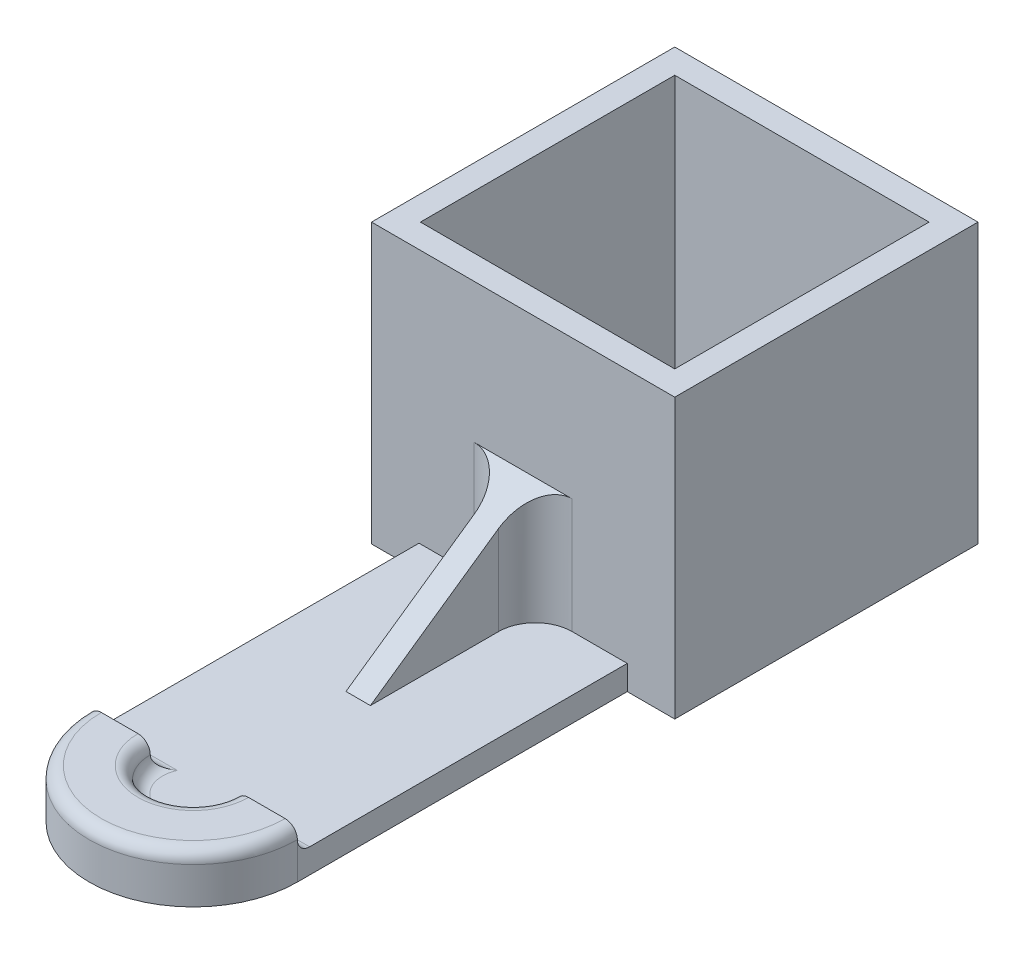
ISO-10303-21;
HEADER;
FILE_DESCRIPTION(('STEP AP214'),'2;1');
FILE_NAME('part.step','',(''),(''),'','','');
FILE_SCHEMA(('AUTOMOTIVE_DESIGN { 1 0 10303 214 1 1 1 1 }'));
ENDSEC;
DATA;
#1=APPLICATION_CONTEXT('core data for automotive mechanical design processes');
#2=APPLICATION_PROTOCOL_DEFINITION('international standard','automotive_design',2000,#1);
#3=PRODUCT_CONTEXT('',#1,'mechanical');
#4=PRODUCT('Part','Part','',(#3));
#5=PRODUCT_RELATED_PRODUCT_CATEGORY('part','',(#4));
#6=PRODUCT_DEFINITION_FORMATION('','',#4);
#7=PRODUCT_DEFINITION_CONTEXT('part definition',#1,'design');
#8=PRODUCT_DEFINITION('design','',#6,#7);
#9=PRODUCT_DEFINITION_SHAPE('','',#8);
#10=(LENGTH_UNIT() NAMED_UNIT(*) SI_UNIT(.MILLI.,.METRE.));
#11=(NAMED_UNIT(*) PLANE_ANGLE_UNIT() SI_UNIT($,.RADIAN.));
#12=(NAMED_UNIT(*) SI_UNIT($,.STERADIAN.) SOLID_ANGLE_UNIT());
#13=UNCERTAINTY_MEASURE_WITH_UNIT(LENGTH_MEASURE(1.E-05),#10,'distance_accuracy_value','');
#14=(GEOMETRIC_REPRESENTATION_CONTEXT(3) GLOBAL_UNCERTAINTY_ASSIGNED_CONTEXT((#13)) GLOBAL_UNIT_ASSIGNED_CONTEXT((#10,
#11,#12)) REPRESENTATION_CONTEXT('',''));
#15=CARTESIAN_POINT('',(0.,0.,0.));
#16=DIRECTION('',(0.,0.,1.));
#17=DIRECTION('',(1.,0.,0.));
#18=AXIS2_PLACEMENT_3D('',#15,#16,#17);
#19=CARTESIAN_POINT('',(0.,20.80083823,2.));
#20=DIRECTION('',(0.,0.,-1.));
#21=DIRECTION('',(-1.,0.,0.));
#22=AXIS2_PLACEMENT_3D('',#19,#20,#21);
#23=PLANE('',#22);
#24=DIRECTION('',(-1.,0.,0.));
#25=VECTOR('',#24,1.);
#26=CARTESIAN_POINT('',(11.400419115,9.400419115,2.));
#27=LINE('',#26,#25);
#28=CARTESIAN_POINT('',(14.400419115,9.400419115,2.));
#29=VERTEX_POINT('',#28);
#30=CARTESIAN_POINT('',(6.400419115,9.400419115,2.));
#31=VERTEX_POINT('',#30);
#32=EDGE_CURVE('E232',#29,#31,#27,.T.);
#33=ORIENTED_EDGE('',*,*,#32,.F.);
#34=DIRECTION('',(0.,1.,0.));
#35=VECTOR('',#34,1.);
#36=CARTESIAN_POINT('',(14.400419115,0.,2.));
#37=LINE('',#36,#35);
#38=CARTESIAN_POINT('',(14.400419115,0.,2.));
#39=VERTEX_POINT('',#38);
#40=EDGE_CURVE('E375',#29,#39,#37,.F.);
#41=ORIENTED_EDGE('',*,*,#40,.T.);
#42=DIRECTION('',(-1.,0.,0.));
#43=VECTOR('',#42,1.);
#44=CARTESIAN_POINT('',(0.,0.,2.));
#45=LINE('',#44,#43);
#46=CARTESIAN_POINT('',(18.9158746218516,0.,2.));
#47=VERTEX_POINT('',#46);
#48=EDGE_CURVE('E366',#47,#39,#45,.T.);
#49=ORIENTED_EDGE('',*,*,#48,.F.);
#50=DIRECTION('',(0.,-1.,0.));
#51=VECTOR('',#50,1.);
#52=CARTESIAN_POINT('',(18.9158746218516,0.,2.));
#53=LINE('',#52,#51);
#54=CARTESIAN_POINT('',(18.9158746218516,-2.,2.));
#55=VERTEX_POINT('',#54);
#56=EDGE_CURVE('E258',#47,#55,#53,.T.);
#57=ORIENTED_EDGE('',*,*,#56,.T.);
#58=DIRECTION('',(-1.,0.,0.));
#59=VECTOR('',#58,1.);
#60=CARTESIAN_POINT('',(22.80083823,-2.,2.));
#61=LINE('',#60,#59);
#62=CARTESIAN_POINT('',(22.80083823,-2.,2.));
#63=VERTEX_POINT('',#62);
#64=EDGE_CURVE('E281',#63,#55,#61,.T.);
#65=ORIENTED_EDGE('',*,*,#64,.F.);
#66=DIRECTION('',(0.,-1.,0.));
#67=VECTOR('',#66,1.);
#68=CARTESIAN_POINT('',(22.80083823,20.80083823,2.));
#69=LINE('',#68,#67);
#70=CARTESIAN_POINT('',(22.80083823,20.80083823,2.));
#71=VERTEX_POINT('',#70);
#72=EDGE_CURVE('E358',#71,#63,#69,.T.);
#73=ORIENTED_EDGE('',*,*,#72,.F.);
#74=DIRECTION('',(1.,0.,0.));
#75=VECTOR('',#74,1.);
#76=CARTESIAN_POINT('',(0.,20.80083823,2.));
#77=LINE('',#76,#75);
#78=CARTESIAN_POINT('',(-2.,20.80083823,2.));
#79=VERTEX_POINT('',#78);
#80=EDGE_CURVE('E343',#79,#71,#77,.T.);
#81=ORIENTED_EDGE('',*,*,#80,.F.);
#82=DIRECTION('',(0.,-1.,0.));
#83=VECTOR('',#82,1.);
#84=CARTESIAN_POINT('',(-2.,20.80083823,2.));
#85=LINE('',#84,#83);
#86=CARTESIAN_POINT('',(-2.,-2.,2.));
#87=VERTEX_POINT('',#86);
#88=EDGE_CURVE('E361',#79,#87,#85,.T.);
#89=ORIENTED_EDGE('',*,*,#88,.T.);
#90=CARTESIAN_POINT('',(1.88496360814838,-2.,2.));
#91=VERTEX_POINT('',#90);
#92=EDGE_CURVE('E272',#91,#87,#61,.T.);
#93=ORIENTED_EDGE('',*,*,#92,.F.);
#94=DIRECTION('',(0.,-1.,0.));
#95=VECTOR('',#94,1.);
#96=CARTESIAN_POINT('',(1.88496360814838,0.,2.));
#97=LINE('',#96,#95);
#98=CARTESIAN_POINT('',(1.88496360814838,0.,2.));
#99=VERTEX_POINT('',#98);
#100=EDGE_CURVE('E268',#99,#91,#97,.T.);
#101=ORIENTED_EDGE('',*,*,#100,.F.);
#102=CARTESIAN_POINT('',(6.400419115,0.,2.));
#103=VERTEX_POINT('',#102);
#104=EDGE_CURVE('E365',#103,#99,#45,.T.);
#105=ORIENTED_EDGE('',*,*,#104,.F.);
#106=DIRECTION('',(0.,1.,0.));
#107=VECTOR('',#106,1.);
#108=CARTESIAN_POINT('',(6.400419115,20.80083823,2.));
#109=LINE('',#108,#107);
#110=EDGE_CURVE('E371',#103,#31,#109,.T.);
#111=ORIENTED_EDGE('',*,*,#110,.T.);
#112=EDGE_LOOP('',(#33,#41,#49,#57,#65,#73,#81,#89,#93,#101,#105,#111));
#113=FACE_BOUND('',#112,.T.);
#114=ADVANCED_FACE('F63',(#113),#23,.F.);
#115=CARTESIAN_POINT('',(10.400419115,0.,2.));
#116=DIRECTION('',(0.,-1.,0.));
#117=DIRECTION('',(0.,0.,-1.));
#118=AXIS2_PLACEMENT_3D('',#115,#116,#117);
#119=PLANE('',#118);
#120=CARTESIAN_POINT('',(10.400419115,0.,28.9804173359016));
#121=DIRECTION('',(0.,-1.,0.));
#122=DIRECTION('',(0.,0.,-1.));
#123=AXIS2_PLACEMENT_3D('',#120,#121,#122);
#124=CIRCLE('',#123,2.51545550685162);
#125=CARTESIAN_POINT('',(8.09227778333287,0.,27.9804173359016));
#126=VERTEX_POINT('',#125);
#127=CARTESIAN_POINT('',(12.7085604466671,0.,27.9804173359016));
#128=VERTEX_POINT('',#127);
#129=EDGE_CURVE('E392',#126,#128,#124,.F.);
#130=ORIENTED_EDGE('',*,*,#129,.T.);
#131=DIRECTION('',(1.,0.,0.));
#132=VECTOR('',#131,1.);
#133=CARTESIAN_POINT('',(10.400419115,0.,27.9804173359016));
#134=LINE('',#133,#132);
#135=CARTESIAN_POINT('',(18.9158746218516,0.,27.9804173359016));
#136=VERTEX_POINT('',#135);
#137=EDGE_CURVE('E398',#128,#136,#134,.T.);
#138=ORIENTED_EDGE('',*,*,#137,.T.);
#139=DIRECTION('',(0.,0.,1.));
#140=VECTOR('',#139,1.);
#141=CARTESIAN_POINT('',(18.9158746218516,0.,2.));
#142=LINE('',#141,#140);
#143=EDGE_CURVE('E250',#47,#136,#142,.T.);
#144=ORIENTED_EDGE('',*,*,#143,.F.);
#145=ORIENTED_EDGE('',*,*,#48,.T.);
#146=CARTESIAN_POINT('',(14.400419115,0.,5.));
#147=DIRECTION('',(0.,-1.,0.));
#148=DIRECTION('',(0.,0.,-1.));
#149=AXIS2_PLACEMENT_3D('',#146,#147,#148);
#150=CIRCLE('',#149,3.);
#151=CARTESIAN_POINT('',(11.400419115,0.,5.));
#152=VERTEX_POINT('',#151);
#153=EDGE_CURVE('E237',#39,#152,#150,.F.);
#154=ORIENTED_EDGE('',*,*,#153,.T.);
#155=DIRECTION('',(0.,0.,-1.));
#156=VECTOR('',#155,1.);
#157=CARTESIAN_POINT('',(11.400419115,0.,2.));
#158=LINE('',#157,#156);
#159=CARTESIAN_POINT('',(11.400419115,0.,15.4902086679508));
#160=VERTEX_POINT('',#159);
#161=EDGE_CURVE('E215',#160,#152,#158,.T.);
#162=ORIENTED_EDGE('',*,*,#161,.F.);
#163=DIRECTION('',(-1.,0.,0.));
#164=VECTOR('',#163,1.);
#165=CARTESIAN_POINT('',(11.400419115,0.,15.4902086679508));
#166=LINE('',#165,#164);
#167=CARTESIAN_POINT('',(9.400419115,0.,15.4902086679508));
#168=VERTEX_POINT('',#167);
#169=EDGE_CURVE('E224',#160,#168,#166,.T.);
#170=ORIENTED_EDGE('',*,*,#169,.T.);
#171=DIRECTION('',(0.,0.,-1.));
#172=VECTOR('',#171,1.);
#173=CARTESIAN_POINT('',(9.400419115,0.,2.));
#174=LINE('',#173,#172);
#175=CARTESIAN_POINT('',(9.400419115,0.,5.));
#176=VERTEX_POINT('',#175);
#177=EDGE_CURVE('E221',#168,#176,#174,.T.);
#178=ORIENTED_EDGE('',*,*,#177,.T.);
#179=CARTESIAN_POINT('',(6.400419115,0.,5.));
#180=DIRECTION('',(0.,-1.,0.));
#181=DIRECTION('',(0.,0.,-1.));
#182=AXIS2_PLACEMENT_3D('',#179,#180,#181);
#183=CIRCLE('',#182,3.);
#184=EDGE_CURVE('E378',#176,#103,#183,.F.);
#185=ORIENTED_EDGE('',*,*,#184,.T.);
#186=ORIENTED_EDGE('',*,*,#104,.T.);
#187=DIRECTION('',(0.,0.,-1.));
#188=VECTOR('',#187,1.);
#189=CARTESIAN_POINT('',(1.88496360814838,0.,2.));
#190=LINE('',#189,#188);
#191=CARTESIAN_POINT('',(1.88496360814838,0.,27.9804173359016));
#192=VERTEX_POINT('',#191);
#193=EDGE_CURVE('E254',#192,#99,#190,.T.);
#194=ORIENTED_EDGE('',*,*,#193,.F.);
#195=DIRECTION('',(1.,0.,0.));
#196=VECTOR('',#195,1.);
#197=CARTESIAN_POINT('',(10.400419115,0.,27.9804173359016));
#198=LINE('',#197,#196);
#199=EDGE_CURVE('E395',#192,#126,#198,.T.);
#200=ORIENTED_EDGE('',*,*,#199,.T.);
#201=EDGE_LOOP('',(#130,#138,#144,#145,#154,#162,#170,#178,#185,#186,#194,#200));
#202=FACE_BOUND('',#201,.T.);
#203=ADVANCED_FACE('F234',(#202),#119,.F.);
#204=CARTESIAN_POINT('',(0.,20.80083823,0.));
#205=DIRECTION('',(0.,1.,0.));
#206=DIRECTION('',(0.,0.,1.));
#207=AXIS2_PLACEMENT_3D('',#204,#205,#206);
#208=PLANE('',#207);
#209=DIRECTION('',(0.,0.,1.));
#210=VECTOR('',#209,1.);
#211=CARTESIAN_POINT('',(-2.,20.80083823,0.));
#212=LINE('',#211,#210);
#213=CARTESIAN_POINT('',(-2.,20.80083823,-22.80083823));
#214=VERTEX_POINT('',#213);
#215=EDGE_CURVE('E339',#214,#79,#212,.T.);
#216=ORIENTED_EDGE('',*,*,#215,.T.);
#217=ORIENTED_EDGE('',*,*,#80,.T.);
#218=DIRECTION('',(0.,0.,-1.));
#219=VECTOR('',#218,1.);
#220=CARTESIAN_POINT('',(22.80083823,20.80083823,0.));
#221=LINE('',#220,#219);
#222=CARTESIAN_POINT('',(22.80083823,20.80083823,-22.80083823));
#223=VERTEX_POINT('',#222);
#224=EDGE_CURVE('E346',#71,#223,#221,.T.);
#225=ORIENTED_EDGE('',*,*,#224,.T.);
#226=DIRECTION('',(-1.,0.,0.));
#227=VECTOR('',#226,1.);
#228=CARTESIAN_POINT('',(0.,20.80083823,-22.80083823));
#229=LINE('',#228,#227);
#230=EDGE_CURVE('E349',#223,#214,#229,.T.);
#231=ORIENTED_EDGE('',*,*,#230,.T.);
#232=EDGE_LOOP('',(#216,#217,#225,#231));
#233=FACE_BOUND('',#232,.T.);
#234=DIRECTION('',(1.,0.,0.));
#235=VECTOR('',#234,1.);
#236=CARTESIAN_POINT('',(0.,20.80083823,0.));
#237=LINE('',#236,#235);
#238=CARTESIAN_POINT('',(0.,20.80083823,0.));
#239=VERTEX_POINT('',#238);
#240=CARTESIAN_POINT('',(20.80083823,20.80083823,0.));
#241=VERTEX_POINT('',#240);
#242=EDGE_CURVE('E301',#239,#241,#237,.T.);
#243=ORIENTED_EDGE('',*,*,#242,.F.);
#244=DIRECTION('',(0.,0.,1.));
#245=VECTOR('',#244,1.);
#246=CARTESIAN_POINT('',(0.,20.80083823,0.));
#247=LINE('',#246,#245);
#248=CARTESIAN_POINT('',(0.,20.80083823,-20.80083823));
#249=VERTEX_POINT('',#248);
#250=EDGE_CURVE('E298',#249,#239,#247,.T.);
#251=ORIENTED_EDGE('',*,*,#250,.F.);
#252=DIRECTION('',(-1.,0.,0.));
#253=VECTOR('',#252,1.);
#254=CARTESIAN_POINT('',(0.,20.80083823,-20.80083823));
#255=LINE('',#254,#253);
#256=CARTESIAN_POINT('',(20.80083823,20.80083823,-20.80083823));
#257=VERTEX_POINT('',#256);
#258=EDGE_CURVE('E309',#257,#249,#255,.T.);
#259=ORIENTED_EDGE('',*,*,#258,.F.);
#260=DIRECTION('',(0.,0.,-1.));
#261=VECTOR('',#260,1.);
#262=CARTESIAN_POINT('',(20.80083823,20.80083823,0.));
#263=LINE('',#262,#261);
#264=EDGE_CURVE('E305',#241,#257,#263,.T.);
#265=ORIENTED_EDGE('',*,*,#264,.F.);
#266=EDGE_LOOP('',(#243,#251,#259,#265));
#267=FACE_BOUND('',#266,.T.);
#268=ADVANCED_FACE('F477',(#233,#267),#208,.T.);
#269=CARTESIAN_POINT('',(-2.,20.80083823,0.));
#270=DIRECTION('',(1.,0.,0.));
#271=DIRECTION('',(0.,0.,-1.));
#272=AXIS2_PLACEMENT_3D('',#269,#270,#271);
#273=PLANE('',#272);
#274=DIRECTION('',(0.,-1.,0.));
#275=VECTOR('',#274,1.);
#276=CARTESIAN_POINT('',(-2.,20.80083823,-22.80083823));
#277=LINE('',#276,#275);
#278=CARTESIAN_POINT('',(-2.,-2.,-22.80083823));
#279=VERTEX_POINT('',#278);
#280=EDGE_CURVE('E352',#214,#279,#277,.T.);
#281=ORIENTED_EDGE('',*,*,#280,.T.);
#282=DIRECTION('',(0.,0.,-1.));
#283=VECTOR('',#282,1.);
#284=CARTESIAN_POINT('',(-2.,-2.,2.));
#285=LINE('',#284,#283);
#286=EDGE_CURVE('E285',#87,#279,#285,.T.);
#287=ORIENTED_EDGE('',*,*,#286,.F.);
#288=ORIENTED_EDGE('',*,*,#88,.F.);
#289=ORIENTED_EDGE('',*,*,#215,.F.);
#290=EDGE_LOOP('',(#281,#287,#288,#289));
#291=FACE_BOUND('',#290,.T.);
#292=ADVANCED_FACE('F483',(#291),#273,.F.);
#293=CARTESIAN_POINT('',(22.80083823,20.80083823,0.));
#294=DIRECTION('',(-1.,0.,0.));
#295=DIRECTION('',(0.,0.,1.));
#296=AXIS2_PLACEMENT_3D('',#293,#294,#295);
#297=PLANE('',#296);
#298=ORIENTED_EDGE('',*,*,#72,.T.);
#299=DIRECTION('',(0.,0.,1.));
#300=VECTOR('',#299,1.);
#301=CARTESIAN_POINT('',(22.80083823,-2.,-22.80083823));
#302=LINE('',#301,#300);
#303=CARTESIAN_POINT('',(22.80083823,-2.,-22.80083823));
#304=VERTEX_POINT('',#303);
#305=EDGE_CURVE('E293',#304,#63,#302,.T.);
#306=ORIENTED_EDGE('',*,*,#305,.F.);
#307=DIRECTION('',(0.,-1.,0.));
#308=VECTOR('',#307,1.);
#309=CARTESIAN_POINT('',(22.80083823,20.80083823,-22.80083823));
#310=LINE('',#309,#308);
#311=EDGE_CURVE('E355',#223,#304,#310,.T.);
#312=ORIENTED_EDGE('',*,*,#311,.F.);
#313=ORIENTED_EDGE('',*,*,#224,.F.);
#314=EDGE_LOOP('',(#298,#306,#312,#313));
#315=FACE_BOUND('',#314,.T.);
#316=ADVANCED_FACE('F481',(#315),#297,.F.);
#317=CARTESIAN_POINT('',(0.,20.80083823,-22.80083823));
#318=DIRECTION('',(0.,0.,1.));
#319=DIRECTION('',(1.,0.,0.));
#320=AXIS2_PLACEMENT_3D('',#317,#318,#319);
#321=PLANE('',#320);
#322=ORIENTED_EDGE('',*,*,#311,.T.);
#323=DIRECTION('',(1.,0.,0.));
#324=VECTOR('',#323,1.);
#325=CARTESIAN_POINT('',(-2.,-2.,-22.80083823));
#326=LINE('',#325,#324);
#327=EDGE_CURVE('E289',#279,#304,#326,.T.);
#328=ORIENTED_EDGE('',*,*,#327,.F.);
#329=ORIENTED_EDGE('',*,*,#280,.F.);
#330=ORIENTED_EDGE('',*,*,#230,.F.);
#331=EDGE_LOOP('',(#322,#328,#329,#330));
#332=FACE_BOUND('',#331,.T.);
#333=ADVANCED_FACE('F522',(#332),#321,.F.);
#334=CARTESIAN_POINT('',(0.,20.80083823,0.));
#335=DIRECTION('',(1.,0.,0.));
#336=DIRECTION('',(0.,0.,-1.));
#337=AXIS2_PLACEMENT_3D('',#334,#335,#336);
#338=PLANE('',#337);
#339=DIRECTION('',(0.,0.,1.));
#340=VECTOR('',#339,1.);
#341=CARTESIAN_POINT('',(0.,0.,0.));
#342=LINE('',#341,#340);
#343=CARTESIAN_POINT('',(0.,0.,-20.80083823));
#344=VERTEX_POINT('',#343);
#345=CARTESIAN_POINT('',(0.,0.,0.));
#346=VERTEX_POINT('',#345);
#347=EDGE_CURVE('E297',#344,#346,#342,.T.);
#348=ORIENTED_EDGE('',*,*,#347,.F.);
#349=DIRECTION('',(0.,-1.,0.));
#350=VECTOR('',#349,1.);
#351=CARTESIAN_POINT('',(0.,20.80083823,-20.80083823));
#352=LINE('',#351,#350);
#353=EDGE_CURVE('E312',#249,#344,#352,.T.);
#354=ORIENTED_EDGE('',*,*,#353,.F.);
#355=ORIENTED_EDGE('',*,*,#250,.T.);
#356=DIRECTION('',(0.,-1.,0.));
#357=VECTOR('',#356,1.);
#358=CARTESIAN_POINT('',(0.,20.80083823,0.));
#359=LINE('',#358,#357);
#360=EDGE_CURVE('E335',#239,#346,#359,.T.);
#361=ORIENTED_EDGE('',*,*,#360,.T.);
#362=EDGE_LOOP('',(#348,#354,#355,#361));
#363=FACE_BOUND('',#362,.T.);
#364=ADVANCED_FACE('F600',(#363),#338,.T.);
#365=CARTESIAN_POINT('',(0.,20.80083823,0.));
#366=DIRECTION('',(0.,0.,-1.));
#367=DIRECTION('',(-1.,0.,0.));
#368=AXIS2_PLACEMENT_3D('',#365,#366,#367);
#369=PLANE('',#368);
#370=DIRECTION('',(1.,0.,0.));
#371=VECTOR('',#370,1.);
#372=CARTESIAN_POINT('',(0.,0.,0.));
#373=LINE('',#372,#371);
#374=CARTESIAN_POINT('',(20.80083823,0.,0.));
#375=VERTEX_POINT('',#374);
#376=EDGE_CURVE('E316',#346,#375,#373,.T.);
#377=ORIENTED_EDGE('',*,*,#376,.F.);
#378=ORIENTED_EDGE('',*,*,#360,.F.);
#379=ORIENTED_EDGE('',*,*,#242,.T.);
#380=DIRECTION('',(0.,-1.,0.));
#381=VECTOR('',#380,1.);
#382=CARTESIAN_POINT('',(20.80083823,20.80083823,0.));
#383=LINE('',#382,#381);
#384=EDGE_CURVE('E331',#241,#375,#383,.T.);
#385=ORIENTED_EDGE('',*,*,#384,.T.);
#386=EDGE_LOOP('',(#377,#378,#379,#385));
#387=FACE_BOUND('',#386,.T.);
#388=ADVANCED_FACE('F596',(#387),#369,.T.);
#389=CARTESIAN_POINT('',(20.80083823,20.80083823,0.));
#390=DIRECTION('',(-1.,0.,0.));
#391=DIRECTION('',(0.,0.,1.));
#392=AXIS2_PLACEMENT_3D('',#389,#390,#391);
#393=PLANE('',#392);
#394=DIRECTION('',(0.,0.,-1.));
#395=VECTOR('',#394,1.);
#396=CARTESIAN_POINT('',(20.80083823,0.,0.));
#397=LINE('',#396,#395);
#398=CARTESIAN_POINT('',(20.80083823,0.,-20.80083823));
#399=VERTEX_POINT('',#398);
#400=EDGE_CURVE('E319',#375,#399,#397,.T.);
#401=ORIENTED_EDGE('',*,*,#400,.F.);
#402=ORIENTED_EDGE('',*,*,#384,.F.);
#403=ORIENTED_EDGE('',*,*,#264,.T.);
#404=DIRECTION('',(0.,-1.,0.));
#405=VECTOR('',#404,1.);
#406=CARTESIAN_POINT('',(20.80083823,20.80083823,-20.80083823));
#407=LINE('',#406,#405);
#408=EDGE_CURVE('E328',#257,#399,#407,.T.);
#409=ORIENTED_EDGE('',*,*,#408,.T.);
#410=EDGE_LOOP('',(#401,#402,#403,#409));
#411=FACE_BOUND('',#410,.T.);
#412=ADVANCED_FACE('F592',(#411),#393,.T.);
#413=CARTESIAN_POINT('',(0.,20.80083823,-20.80083823));
#414=DIRECTION('',(0.,0.,1.));
#415=DIRECTION('',(1.,0.,0.));
#416=AXIS2_PLACEMENT_3D('',#413,#414,#415);
#417=PLANE('',#416);
#418=DIRECTION('',(-1.,0.,0.));
#419=VECTOR('',#418,1.);
#420=CARTESIAN_POINT('',(0.,0.,-20.80083823));
#421=LINE('',#420,#419);
#422=EDGE_CURVE('E302',#399,#344,#421,.T.);
#423=ORIENTED_EDGE('',*,*,#422,.F.);
#424=ORIENTED_EDGE('',*,*,#408,.F.);
#425=ORIENTED_EDGE('',*,*,#258,.T.);
#426=ORIENTED_EDGE('',*,*,#353,.T.);
#427=EDGE_LOOP('',(#423,#424,#425,#426));
#428=FACE_BOUND('',#427,.T.);
#429=ADVANCED_FACE('F588',(#428),#417,.T.);
#430=CARTESIAN_POINT('',(0.,0.,0.));
#431=DIRECTION('',(0.,-1.,0.));
#432=DIRECTION('',(0.,0.,-1.));
#433=AXIS2_PLACEMENT_3D('',#430,#431,#432);
#434=PLANE('',#433);
#435=ORIENTED_EDGE('',*,*,#376,.T.);
#436=ORIENTED_EDGE('',*,*,#400,.T.);
#437=ORIENTED_EDGE('',*,*,#422,.T.);
#438=ORIENTED_EDGE('',*,*,#347,.T.);
#439=EDGE_LOOP('',(#435,#436,#437,#438));
#440=FACE_BOUND('',#439,.T.);
#441=ADVANCED_FACE('F585',(#440),#434,.F.);
#442=CARTESIAN_POINT('',(0.,-2.,0.));
#443=DIRECTION('',(0.,-1.,0.));
#444=DIRECTION('',(0.,0.,-1.));
#445=AXIS2_PLACEMENT_3D('',#442,#443,#444);
#446=PLANE('',#445);
#447=ORIENTED_EDGE('',*,*,#64,.T.);
#448=DIRECTION('',(0.,0.,1.));
#449=VECTOR('',#448,1.);
#450=CARTESIAN_POINT('',(18.9158746218516,-2.,2.));
#451=LINE('',#450,#449);
#452=CARTESIAN_POINT('',(18.9158746218516,-2.,28.9804173359016));
#453=VERTEX_POINT('',#452);
#454=EDGE_CURVE('E249',#55,#453,#451,.T.);
#455=ORIENTED_EDGE('',*,*,#454,.T.);
#456=CARTESIAN_POINT('',(10.400419115,-2.,28.9804173359016));
#457=DIRECTION('',(0.,-1.,0.));
#458=DIRECTION('',(0.,0.,-1.));
#459=AXIS2_PLACEMENT_3D('',#456,#457,#458);
#460=CIRCLE('',#459,8.51545550685162);
#461=CARTESIAN_POINT('',(1.88496360814838,-2.,28.9804173359016));
#462=VERTEX_POINT('',#461);
#463=EDGE_CURVE('E262',#453,#462,#460,.T.);
#464=ORIENTED_EDGE('',*,*,#463,.T.);
#465=DIRECTION('',(0.,0.,-1.));
#466=VECTOR('',#465,1.);
#467=CARTESIAN_POINT('',(1.88496360814838,-2.,2.));
#468=LINE('',#467,#466);
#469=EDGE_CURVE('E255',#462,#91,#468,.T.);
#470=ORIENTED_EDGE('',*,*,#469,.T.);
#471=ORIENTED_EDGE('',*,*,#92,.T.);
#472=ORIENTED_EDGE('',*,*,#286,.T.);
#473=ORIENTED_EDGE('',*,*,#327,.T.);
#474=ORIENTED_EDGE('',*,*,#305,.T.);
#475=EDGE_LOOP('',(#447,#455,#464,#470,#471,#472,#473,#474));
#476=FACE_BOUND('',#475,.T.);
#477=ADVANCED_FACE('F512',(#476),#446,.T.);
#478=CARTESIAN_POINT('',(1.88496360814838,0.,2.));
#479=DIRECTION('',(-1.,0.,0.));
#480=DIRECTION('',(0.,0.,1.));
#481=AXIS2_PLACEMENT_3D('',#478,#479,#480);
#482=PLANE('',#481);
#483=ORIENTED_EDGE('',*,*,#469,.F.);
#484=DIRECTION('',(0.,-1.,0.));
#485=VECTOR('',#484,1.);
#486=CARTESIAN_POINT('',(1.88496360814838,0.,28.9804173359016));
#487=LINE('',#486,#485);
#488=CARTESIAN_POINT('',(1.88496360814838,1.,28.9804173359016));
#489=VERTEX_POINT('',#488);
#490=EDGE_CURVE('E273',#489,#462,#487,.T.);
#491=ORIENTED_EDGE('',*,*,#490,.F.);
#492=CARTESIAN_POINT('',(1.88496360814838,1.,27.9804173359016));
#493=DIRECTION('',(-1.,0.,0.));
#494=DIRECTION('',(0.,0.,1.));
#495=AXIS2_PLACEMENT_3D('',#492,#493,#494);
#496=CIRCLE('',#495,1.);
#497=EDGE_CURVE('E12',#489,#192,#496,.F.);
#498=ORIENTED_EDGE('',*,*,#497,.T.);
#499=ORIENTED_EDGE('',*,*,#193,.T.);
#500=ORIENTED_EDGE('',*,*,#100,.T.);
#501=EDGE_LOOP('',(#483,#491,#498,#499,#500));
#502=FACE_BOUND('',#501,.T.);
#503=ADVANCED_FACE('F537',(#502),#482,.T.);
#504=CARTESIAN_POINT('',(10.400419115,0.,28.9804173359016));
#505=DIRECTION('',(0.,-1.,0.));
#506=DIRECTION('',(0.,0.,-1.));
#507=AXIS2_PLACEMENT_3D('',#504,#505,#506);
#508=CYLINDRICAL_SURFACE('',#507,8.51545550685162);
#509=DIRECTION('',(0.,-1.,0.));
#510=VECTOR('',#509,1.);
#511=CARTESIAN_POINT('',(18.9158746218516,0.,28.9804173359016));
#512=LINE('',#511,#510);
#513=CARTESIAN_POINT('',(18.9158746218516,1.,28.9804173359016));
#514=VERTEX_POINT('',#513);
#515=EDGE_CURVE('E82',#514,#453,#512,.T.);
#516=ORIENTED_EDGE('',*,*,#515,.F.);
#517=CARTESIAN_POINT('',(10.400419115,1.,28.9804173359016));
#518=DIRECTION('',(0.,1.,0.));
#519=DIRECTION('',(0.,0.,1.));
#520=AXIS2_PLACEMENT_3D('',#517,#518,#519);
#521=CIRCLE('',#520,8.51545550685162);
#522=EDGE_CURVE('E428',#514,#489,#521,.F.);
#523=ORIENTED_EDGE('',*,*,#522,.T.);
#524=ORIENTED_EDGE('',*,*,#490,.T.);
#525=ORIENTED_EDGE('',*,*,#463,.F.);
#526=EDGE_LOOP('',(#516,#523,#524,#525));
#527=FACE_BOUND('',#526,.T.);
#528=ADVANCED_FACE('F533',(#527),#508,.T.);
#529=CARTESIAN_POINT('',(18.9158746218516,0.,2.));
#530=DIRECTION('',(1.,0.,0.));
#531=DIRECTION('',(0.,0.,-1.));
#532=AXIS2_PLACEMENT_3D('',#529,#530,#531);
#533=PLANE('',#532);
#534=ORIENTED_EDGE('',*,*,#454,.F.);
#535=ORIENTED_EDGE('',*,*,#56,.F.);
#536=ORIENTED_EDGE('',*,*,#143,.T.);
#537=CARTESIAN_POINT('',(18.9158746218516,1.,27.9804173359016));
#538=DIRECTION('',(1.,0.,0.));
#539=DIRECTION('',(0.,0.,-1.));
#540=AXIS2_PLACEMENT_3D('',#537,#538,#539);
#541=CIRCLE('',#540,1.);
#542=EDGE_CURVE('E74',#136,#514,#541,.F.);
#543=ORIENTED_EDGE('',*,*,#542,.T.);
#544=ORIENTED_EDGE('',*,*,#515,.T.);
#545=EDGE_LOOP('',(#534,#535,#536,#543,#544));
#546=FACE_BOUND('',#545,.T.);
#547=ADVANCED_FACE('F530',(#546),#533,.T.);
#548=CARTESIAN_POINT('',(11.400419115,9.400419115,2.));
#549=DIRECTION('',(0.,-0.820450872824272,-0.571717032527361));
#550=DIRECTION('',(0.,0.571717032527361,-0.820450872824272));
#551=AXIS2_PLACEMENT_3D('',#548,#549,#550);
#552=PLANE('',#551);
#553=ORIENTED_EDGE('',*,*,#32,.T.);
#554=CARTESIAN_POINT('',(6.400419115,7.30992088482816,5.));
#555=DIRECTION('',(0.,-0.820450872824272,-0.571717032527361));
#556=DIRECTION('',(0.,0.571717032527361,-0.820450872824272));
#557=AXIS2_PLACEMENT_3D('',#554,#555,#556);
#558=ELLIPSE('',#557,3.65652606313036,3.);
#559=CARTESIAN_POINT('',(9.400419115,7.30992088482816,5.));
#560=VERTEX_POINT('',#559);
#561=EDGE_CURVE('E389',#31,#560,#558,.T.);
#562=ORIENTED_EDGE('',*,*,#561,.T.);
#563=DIRECTION('',(0.,-0.571717032527361,0.820450872824272));
#564=VECTOR('',#563,1.);
#565=CARTESIAN_POINT('',(9.400419115,9.400419115,2.));
#566=LINE('',#565,#564);
#567=EDGE_CURVE('E227',#560,#168,#566,.T.);
#568=ORIENTED_EDGE('',*,*,#567,.T.);
#569=ORIENTED_EDGE('',*,*,#169,.F.);
#570=DIRECTION('',(0.,-0.571717032527361,0.820450872824272));
#571=VECTOR('',#570,1.);
#572=CARTESIAN_POINT('',(11.400419115,9.400419115,2.));
#573=LINE('',#572,#571);
#574=CARTESIAN_POINT('',(11.400419115,7.30992088482816,5.));
#575=VERTEX_POINT('',#574);
#576=EDGE_CURVE('E211',#575,#160,#573,.T.);
#577=ORIENTED_EDGE('',*,*,#576,.F.);
#578=CARTESIAN_POINT('',(14.400419115,7.30992088482816,5.));
#579=DIRECTION('',(0.,-0.820450872824272,-0.571717032527361));
#580=DIRECTION('',(0.,-0.571717032527361,0.820450872824272));
#581=AXIS2_PLACEMENT_3D('',#578,#579,#580);
#582=ELLIPSE('',#581,3.65652606313036,3.);
#583=EDGE_CURVE('E386',#575,#29,#582,.T.);
#584=ORIENTED_EDGE('',*,*,#583,.T.);
#585=EDGE_LOOP('',(#553,#562,#568,#569,#577,#584));
#586=FACE_BOUND('',#585,.T.);
#587=ADVANCED_FACE('F225',(#586),#552,.F.);
#588=CARTESIAN_POINT('',(11.400419115,0.,0.));
#589=DIRECTION('',(-1.,0.,0.));
#590=DIRECTION('',(0.,0.,1.));
#591=AXIS2_PLACEMENT_3D('',#588,#589,#590);
#592=PLANE('',#591);
#593=ORIENTED_EDGE('',*,*,#161,.T.);
#594=DIRECTION('',(0.,1.,0.));
#595=VECTOR('',#594,1.);
#596=CARTESIAN_POINT('',(11.400419115,9.400419115,5.));
#597=LINE('',#596,#595);
#598=EDGE_CURVE('E217',#152,#575,#597,.T.);
#599=ORIENTED_EDGE('',*,*,#598,.T.);
#600=ORIENTED_EDGE('',*,*,#576,.T.);
#601=EDGE_LOOP('',(#593,#599,#600));
#602=FACE_BOUND('',#601,.T.);
#603=ADVANCED_FACE('F213',(#602),#592,.F.);
#604=CARTESIAN_POINT('',(9.400419115,0.,0.));
#605=DIRECTION('',(-1.,0.,0.));
#606=DIRECTION('',(0.,0.,1.));
#607=AXIS2_PLACEMENT_3D('',#604,#605,#606);
#608=PLANE('',#607);
#609=ORIENTED_EDGE('',*,*,#567,.F.);
#610=DIRECTION('',(0.,1.,0.));
#611=VECTOR('',#610,1.);
#612=CARTESIAN_POINT('',(9.400419115,0.,5.));
#613=LINE('',#612,#611);
#614=EDGE_CURVE('E383',#560,#176,#613,.F.);
#615=ORIENTED_EDGE('',*,*,#614,.T.);
#616=ORIENTED_EDGE('',*,*,#177,.F.);
#617=EDGE_LOOP('',(#609,#615,#616));
#618=FACE_BOUND('',#617,.T.);
#619=ADVANCED_FACE('F490',(#618),#608,.T.);
#620=CARTESIAN_POINT('',(14.400419115,0.,5.));
#621=DIRECTION('',(0.,-1.,0.));
#622=DIRECTION('',(0.,0.,-1.));
#623=AXIS2_PLACEMENT_3D('',#620,#621,#622);
#624=CYLINDRICAL_SURFACE('',#623,3.);
#625=ORIENTED_EDGE('',*,*,#153,.F.);
#626=ORIENTED_EDGE('',*,*,#40,.F.);
#627=ORIENTED_EDGE('',*,*,#583,.F.);
#628=ORIENTED_EDGE('',*,*,#598,.F.);
#629=EDGE_LOOP('',(#625,#626,#627,#628));
#630=FACE_BOUND('',#629,.T.);
#631=ADVANCED_FACE('F487',(#630),#624,.F.);
#632=CARTESIAN_POINT('',(6.400419115,20.80083823,5.));
#633=DIRECTION('',(0.,1.,0.));
#634=DIRECTION('',(0.,0.,1.));
#635=AXIS2_PLACEMENT_3D('',#632,#633,#634);
#636=CYLINDRICAL_SURFACE('',#635,3.);
#637=ORIENTED_EDGE('',*,*,#184,.F.);
#638=ORIENTED_EDGE('',*,*,#614,.F.);
#639=ORIENTED_EDGE('',*,*,#561,.F.);
#640=ORIENTED_EDGE('',*,*,#110,.F.);
#641=EDGE_LOOP('',(#637,#638,#639,#640));
#642=FACE_BOUND('',#641,.T.);
#643=ADVANCED_FACE('F489',(#642),#636,.F.);
#644=CARTESIAN_POINT('',(13.9158746218516,2.,28.9804173359016));
#645=DIRECTION('',(0.,0.,-1.));
#646=DIRECTION('',(-1.,0.,0.));
#647=AXIS2_PLACEMENT_3D('',#644,#645,#646);
#648=PLANE('',#647);
#649=DIRECTION('',(1.,0.,0.));
#650=VECTOR('',#649,1.);
#651=CARTESIAN_POINT('',(13.9158746218516,2.,28.9804173359016));
#652=LINE('',#651,#650);
#653=CARTESIAN_POINT('',(14.9158746218516,2.,28.9804173359016));
#654=VERTEX_POINT('',#653);
#655=CARTESIAN_POINT('',(17.9158746218516,2.,28.9804173359016));
#656=VERTEX_POINT('',#655);
#657=EDGE_CURVE('E561',#654,#656,#652,.T.);
#658=ORIENTED_EDGE('',*,*,#657,.T.);
#659=CARTESIAN_POINT('',(17.9158746218516,1.,28.9804173359016));
#660=DIRECTION('',(0.,0.,-1.));
#661=DIRECTION('',(-1.,0.,0.));
#662=AXIS2_PLACEMENT_3D('',#659,#660,#661);
#663=CIRCLE('',#662,1.);
#664=EDGE_CURVE('E408',#656,#514,#663,.T.);
#665=ORIENTED_EDGE('',*,*,#664,.T.);
#666=DIRECTION('',(1.,0.,0.));
#667=VECTOR('',#666,1.);
#668=CARTESIAN_POINT('',(13.9158746218516,1.,28.9804173359016));
#669=LINE('',#668,#667);
#670=CARTESIAN_POINT('',(13.9158746218516,1.,28.9804173359016));
#671=VERTEX_POINT('',#670);
#672=EDGE_CURVE('E405',#514,#671,#669,.F.);
#673=ORIENTED_EDGE('',*,*,#672,.T.);
#674=CARTESIAN_POINT('',(14.9158746218516,1.,28.9804173359016));
#675=DIRECTION('',(0.,0.,-1.));
#676=DIRECTION('',(-1.,0.,0.));
#677=AXIS2_PLACEMENT_3D('',#674,#675,#676);
#678=CIRCLE('',#677,1.);
#679=EDGE_CURVE('E402',#671,#654,#678,.T.);
#680=ORIENTED_EDGE('',*,*,#679,.T.);
#681=EDGE_LOOP('',(#658,#665,#673,#680));
#682=FACE_BOUND('',#681,.T.);
#683=ADVANCED_FACE('F493',(#682),#648,.T.);
#684=CARTESIAN_POINT('',(1.88496360814838,2.,28.9804173359016));
#685=DIRECTION('',(0.,0.,-1.));
#686=DIRECTION('',(-1.,0.,0.));
#687=AXIS2_PLACEMENT_3D('',#684,#685,#686);
#688=PLANE('',#687);
#689=DIRECTION('',(1.,0.,0.));
#690=VECTOR('',#689,1.);
#691=CARTESIAN_POINT('',(1.88496360814838,1.,28.9804173359016));
#692=LINE('',#691,#690);
#693=CARTESIAN_POINT('',(6.88496360814838,1.,28.9804173359016));
#694=VERTEX_POINT('',#693);
#695=EDGE_CURVE('E414',#694,#489,#692,.F.);
#696=ORIENTED_EDGE('',*,*,#695,.T.);
#697=CARTESIAN_POINT('',(2.88496360814838,1.,28.9804173359016));
#698=DIRECTION('',(0.,0.,-1.));
#699=DIRECTION('',(-1.,0.,0.));
#700=AXIS2_PLACEMENT_3D('',#697,#698,#699);
#701=CIRCLE('',#700,1.);
#702=CARTESIAN_POINT('',(2.88496360814838,2.,28.9804173359016));
#703=VERTEX_POINT('',#702);
#704=EDGE_CURVE('E418',#489,#703,#701,.T.);
#705=ORIENTED_EDGE('',*,*,#704,.T.);
#706=DIRECTION('',(1.,0.,0.));
#707=VECTOR('',#706,1.);
#708=CARTESIAN_POINT('',(1.88496360814838,2.,28.9804173359016));
#709=LINE('',#708,#707);
#710=CARTESIAN_POINT('',(5.88496360814838,2.,28.9804173359016));
#711=VERTEX_POINT('',#710);
#712=EDGE_CURVE('E244',#703,#711,#709,.T.);
#713=ORIENTED_EDGE('',*,*,#712,.T.);
#714=CARTESIAN_POINT('',(5.88496360814838,1.,28.9804173359016));
#715=DIRECTION('',(0.,0.,-1.));
#716=DIRECTION('',(-1.,0.,0.));
#717=AXIS2_PLACEMENT_3D('',#714,#715,#716);
#718=CIRCLE('',#717,1.);
#719=EDGE_CURVE('E411',#711,#694,#718,.T.);
#720=ORIENTED_EDGE('',*,*,#719,.T.);
#721=EDGE_LOOP('',(#696,#705,#713,#720));
#722=FACE_BOUND('',#721,.T.);
#723=ADVANCED_FACE('F467',(#722),#688,.T.);
#724=CARTESIAN_POINT('',(10.400419115,2.,28.9804173359016));
#725=DIRECTION('',(0.,1.,0.));
#726=DIRECTION('',(1.,0.,0.));
#727=AXIS2_PLACEMENT_3D('',#724,#725,#726);
#728=PLANE('',#727);
#729=ORIENTED_EDGE('',*,*,#712,.F.);
#730=CARTESIAN_POINT('',(10.400419115,2.,28.9804173359016));
#731=DIRECTION('',(0.,1.,0.));
#732=DIRECTION('',(0.,0.,1.));
#733=AXIS2_PLACEMENT_3D('',#730,#731,#732);
#734=CIRCLE('',#733,7.51545550685162);
#735=EDGE_CURVE('E424',#703,#656,#734,.T.);
#736=ORIENTED_EDGE('',*,*,#735,.T.);
#737=ORIENTED_EDGE('',*,*,#657,.F.);
#738=CARTESIAN_POINT('',(10.400419115,2.,28.9804173359016));
#739=DIRECTION('',(0.,1.,0.));
#740=DIRECTION('',(0.,0.,1.));
#741=AXIS2_PLACEMENT_3D('',#738,#739,#740);
#742=CIRCLE('',#741,4.51545550685162);
#743=EDGE_CURVE('E421',#654,#711,#742,.F.);
#744=ORIENTED_EDGE('',*,*,#743,.T.);
#745=EDGE_LOOP('',(#729,#736,#737,#744));
#746=FACE_BOUND('',#745,.T.);
#747=ADVANCED_FACE('F462',(#746),#728,.T.);
#748=CARTESIAN_POINT('',(10.400419115,1.,28.9804173359016));
#749=DIRECTION('',(0.,1.,0.));
#750=DIRECTION('',(0.,0.,1.));
#751=AXIS2_PLACEMENT_3D('',#748,#749,#750);
#752=TOROIDAL_SURFACE('',#751,4.51545550685162,1.);
#753=ORIENTED_EDGE('',*,*,#743,.F.);
#754=ORIENTED_EDGE('',*,*,#679,.F.);
#755=CARTESIAN_POINT('',(10.400419115,1.,28.9804173359016));
#756=DIRECTION('',(0.,1.,0.));
#757=DIRECTION('',(0.,0.,1.));
#758=AXIS2_PLACEMENT_3D('',#755,#756,#757);
#759=CIRCLE('',#758,3.51545550685162);
#760=EDGE_CURVE('E67',#694,#671,#759,.T.);
#761=ORIENTED_EDGE('',*,*,#760,.F.);
#762=ORIENTED_EDGE('',*,*,#719,.F.);
#763=EDGE_LOOP('',(#753,#754,#761,#762));
#764=FACE_BOUND('',#763,.T.);
#765=ADVANCED_FACE('F459',(#764),#752,.T.);
#766=CARTESIAN_POINT('',(10.400419115,1.,27.9804173359016));
#767=DIRECTION('',(1.,0.,0.));
#768=DIRECTION('',(0.,0.,-1.));
#769=AXIS2_PLACEMENT_3D('',#766,#767,#768);
#770=CYLINDRICAL_SURFACE('',#769,1.);
#771=ORIENTED_EDGE('',*,*,#497,.F.);
#772=ORIENTED_EDGE('',*,*,#695,.F.);
#773=CARTESIAN_POINT('',(6.88496360814838,1.,28.9804173359016));
#774=CARTESIAN_POINT('',(6.88496155641818,0.977857464568251,28.9804201518887));
#775=CARTESIAN_POINT('',(6.88569964862566,0.955728160489273,28.9796812262835));
#776=CARTESIAN_POINT('',(6.88862913788712,0.911676929635154,28.9767532528616));
#777=CARTESIAN_POINT('',(6.89081957105675,0.889754875093913,28.9745651668197));
#778=CARTESIAN_POINT('',(6.89948051670767,0.824900380933393,28.965925457141));
#779=CARTESIAN_POINT('',(6.9080417608019,0.78249339801548,28.9573970920325));
#780=CARTESIAN_POINT('',(6.93019308918738,0.700512843939239,28.9354617609013));
#781=CARTESIAN_POINT('',(6.94377186892669,0.660933140288543,28.9220657628189));
#782=CARTESIAN_POINT('',(6.97526978917601,0.585165822704754,28.891235707185));
#783=CARTESIAN_POINT('',(6.99319743538839,0.548985051323255,28.8737937393104));
#784=CARTESIAN_POINT('',(7.03992160811412,0.467866288047717,28.8287716563239));
#785=CARTESIAN_POINT('',(7.0702911431432,0.424596953949885,28.7998214936169));
#786=CARTESIAN_POINT('',(7.13615403776967,0.345375526293777,28.7380459400177));
#787=CARTESIAN_POINT('',(7.17165605940202,0.309436055529419,28.7052140153391));
#788=CARTESIAN_POINT('',(7.26232063992158,0.230801939553399,28.6229129488053));
#789=CARTESIAN_POINT('',(7.31946409525921,0.19164198167488,28.5722627629006));
#790=CARTESIAN_POINT('',(7.439129989917,0.12557034921971,28.469416806803));
#791=CARTESIAN_POINT('',(7.5016627176009,0.0986827477070223,28.4172182109698));
#792=CARTESIAN_POINT('',(7.64798081557782,0.0494953112680481,28.2992538215556));
#793=CARTESIAN_POINT('',(7.73294178180857,0.0304003515591355,28.2336348115539));
#794=CARTESIAN_POINT('',(7.90701853825511,0.00577186784401435,28.1058559914978));
#795=CARTESIAN_POINT('',(7.99612939384733,0.000222636079074399,28.0436922565332));
#796=CARTESIAN_POINT('',(8.08859902991179,2.19395118889965E-06,27.9828341329));
#797=CARTESIAN_POINT('',(8.09043809634623,5.68663950377288E-09,27.9816252134028));
#798=CARTESIAN_POINT('',(8.09227778333287,0.,27.9804173359016));
#799=B_SPLINE_CURVE_WITH_KNOTS('',3,(#773,#774,#775,#776,#777,#778,#779,#780,#781,#782,#783,
#784,#785,#786,#787,#788,#789,#790,#791,#792,#793,#794,#795,#796,#797,#798),.UNSPECIFIED.,.F.,
.F.,(4,2,2,2,2,2,2,2,2,2,2,2,4),(0.,0.0663777765426864,0.132711543761181,0.264238263193115,
0.395470440825008,0.526961387368146,0.706778920844337,0.88690355181114,1.14292703789427,
1.39945059570145,1.72531699901974,2.05080534457482,2.05740782918211),.UNSPECIFIED.);
#800=EDGE_CURVE('E443',#126,#694,#799,.F.);
#801=ORIENTED_EDGE('',*,*,#800,.F.);
#802=ORIENTED_EDGE('',*,*,#199,.F.);
#803=EDGE_LOOP('',(#771,#772,#801,#802));
#804=FACE_BOUND('',#803,.T.);
#805=ADVANCED_FACE('F456',(#804),#770,.F.);
#806=CARTESIAN_POINT('',(10.400419115,1.,28.9804173359016));
#807=DIRECTION('',(0.,-1.,0.));
#808=DIRECTION('',(0.,0.,-1.));
#809=AXIS2_PLACEMENT_3D('',#806,#807,#808);
#810=TOROIDAL_SURFACE('',#809,2.51545550685162,1.);
#811=ORIENTED_EDGE('',*,*,#800,.T.);
#812=ORIENTED_EDGE('',*,*,#760,.T.);
#813=CARTESIAN_POINT('',(13.9158746218516,1.,28.9804173359016));
#814=CARTESIAN_POINT('',(13.9158766735818,0.977857464568251,28.9804201518887));
#815=CARTESIAN_POINT('',(13.9151385813743,0.955728160489273,28.9796812262835));
#816=CARTESIAN_POINT('',(13.9122090921129,0.911676929635154,28.9767532528616));
#817=CARTESIAN_POINT('',(13.9100186589433,0.889754875093913,28.9745651668197));
#818=CARTESIAN_POINT('',(13.9013577132923,0.824900380933393,28.965925457141));
#819=CARTESIAN_POINT('',(13.8927964691981,0.78249339801548,28.9573970920325));
#820=CARTESIAN_POINT('',(13.8706451408126,0.700512843939239,28.9354617609013));
#821=CARTESIAN_POINT('',(13.8570663610733,0.660933140288543,28.9220657628189));
#822=CARTESIAN_POINT('',(13.825568440824,0.585165822704754,28.891235707185));
#823=CARTESIAN_POINT('',(13.8076407946116,0.548985051323255,28.8737937393104));
#824=CARTESIAN_POINT('',(13.7609166218859,0.467866288047718,28.8287716563239));
#825=CARTESIAN_POINT('',(13.7305470868568,0.424596953949887,28.7998214936169));
#826=CARTESIAN_POINT('',(13.6646841922303,0.345375526293779,28.7380459400177));
#827=CARTESIAN_POINT('',(13.629182170598,0.309436055529419,28.7052140153391));
#828=CARTESIAN_POINT('',(13.5385175900784,0.230801939553399,28.6229129488053));
#829=CARTESIAN_POINT('',(13.4813741347408,0.191641981674881,28.5722627629006));
#830=CARTESIAN_POINT('',(13.361708240083,0.125570349219712,28.469416806803));
#831=CARTESIAN_POINT('',(13.2991755123991,0.0986827477070241,28.4172182109698));
#832=CARTESIAN_POINT('',(13.1528574144222,0.0494953112680488,28.2992538215556));
#833=CARTESIAN_POINT('',(13.0678964481914,0.0304003515591354,28.2336348115539));
#834=CARTESIAN_POINT('',(12.8938196917449,0.00577186784401469,28.1058559914978));
#835=CARTESIAN_POINT('',(12.8047088361527,0.0002226360790762,28.0436922565332));
#836=CARTESIAN_POINT('',(12.7122392000882,2.1939511889724E-06,27.9828341329));
#837=CARTESIAN_POINT('',(12.7104001336538,5.68663954084661E-09,27.9816252134028));
#838=CARTESIAN_POINT('',(12.7085604466671,0.,27.9804173359016));
#839=B_SPLINE_CURVE_WITH_KNOTS('',3,(#813,#814,#815,#816,#817,#818,#819,#820,#821,#822,#823,
#824,#825,#826,#827,#828,#829,#830,#831,#832,#833,#834,#835,#836,#837,#838),.UNSPECIFIED.,.F.,
.F.,(4,2,2,2,2,2,2,2,2,2,2,2,4),(0.,0.0663777765426862,0.132711543761181,0.264238263193115,
0.395470440825009,0.526961387368146,0.706778920844333,0.88690355181114,1.14292703789427,
1.39945059570145,1.72531699901974,2.05080534457482,2.05740782918211),.UNSPECIFIED.);
#840=EDGE_CURVE('E434',#128,#671,#839,.F.);
#841=ORIENTED_EDGE('',*,*,#840,.F.);
#842=ORIENTED_EDGE('',*,*,#129,.F.);
#843=EDGE_LOOP('',(#811,#812,#841,#842));
#844=FACE_BOUND('',#843,.T.);
#845=ADVANCED_FACE('F449',(#844),#810,.F.);
#846=CARTESIAN_POINT('',(10.400419115,1.,27.9804173359016));
#847=DIRECTION('',(1.,0.,0.));
#848=DIRECTION('',(0.,0.,-1.));
#849=AXIS2_PLACEMENT_3D('',#846,#847,#848);
#850=CYLINDRICAL_SURFACE('',#849,1.);
#851=ORIENTED_EDGE('',*,*,#840,.T.);
#852=ORIENTED_EDGE('',*,*,#672,.F.);
#853=ORIENTED_EDGE('',*,*,#542,.F.);
#854=ORIENTED_EDGE('',*,*,#137,.F.);
#855=EDGE_LOOP('',(#851,#852,#853,#854));
#856=FACE_BOUND('',#855,.T.);
#857=ADVANCED_FACE('F452',(#856),#850,.F.);
#858=CARTESIAN_POINT('',(10.400419115,1.,28.9804173359016));
#859=DIRECTION('',(0.,1.,0.));
#860=DIRECTION('',(0.,0.,1.));
#861=AXIS2_PLACEMENT_3D('',#858,#859,#860);
#862=TOROIDAL_SURFACE('',#861,7.51545550685162,1.);
#863=ORIENTED_EDGE('',*,*,#704,.F.);
#864=ORIENTED_EDGE('',*,*,#522,.F.);
#865=ORIENTED_EDGE('',*,*,#664,.F.);
#866=ORIENTED_EDGE('',*,*,#735,.F.);
#867=EDGE_LOOP('',(#863,#864,#865,#866));
#868=FACE_BOUND('',#867,.T.);
#869=ADVANCED_FACE('F65',(#868),#862,.T.);
#870=CLOSED_SHELL('',(#114,#203,#268,#292,#316,#333,#364,#388,#412,#429,#441,#477,#503,#528,
#547,#587,#603,#619,#631,#643,#683,#723,#747,#765,#805,#845,#857,#869));
#871=MANIFOLD_SOLID_BREP('B2',#870);
#872=ADVANCED_BREP_SHAPE_REPRESENTATION('',(#18,#871),#14);
#873=SHAPE_DEFINITION_REPRESENTATION(#9,#872);
ENDSEC;
END-ISO-10303-21;
